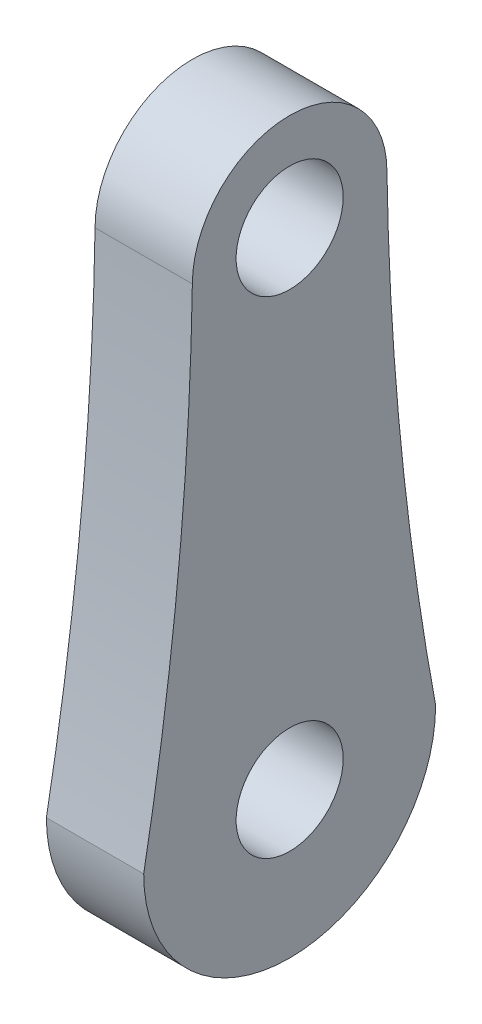
ISO-10303-21;
HEADER;
FILE_DESCRIPTION(('STEP AP214'),'2;1');
FILE_NAME('part.step','',(''),(''),'','','');
FILE_SCHEMA(('AUTOMOTIVE_DESIGN { 1 0 10303 214 1 1 1 1 }'));
ENDSEC;
DATA;
#1=APPLICATION_CONTEXT('core data for automotive mechanical design processes');
#2=APPLICATION_PROTOCOL_DEFINITION('international standard','automotive_design',2000,#1);
#3=PRODUCT_CONTEXT('',#1,'mechanical');
#4=PRODUCT('Part','Part','',(#3));
#5=PRODUCT_RELATED_PRODUCT_CATEGORY('part','',(#4));
#6=PRODUCT_DEFINITION_FORMATION('','',#4);
#7=PRODUCT_DEFINITION_CONTEXT('part definition',#1,'design');
#8=PRODUCT_DEFINITION('design','',#6,#7);
#9=PRODUCT_DEFINITION_SHAPE('','',#8);
#10=(LENGTH_UNIT() NAMED_UNIT(*) SI_UNIT(.MILLI.,.METRE.));
#11=(NAMED_UNIT(*) PLANE_ANGLE_UNIT() SI_UNIT($,.RADIAN.));
#12=(NAMED_UNIT(*) SI_UNIT($,.STERADIAN.) SOLID_ANGLE_UNIT());
#13=UNCERTAINTY_MEASURE_WITH_UNIT(LENGTH_MEASURE(1.E-05),#10,'distance_accuracy_value','');
#14=(GEOMETRIC_REPRESENTATION_CONTEXT(3) GLOBAL_UNCERTAINTY_ASSIGNED_CONTEXT((#13)) GLOBAL_UNIT_ASSIGNED_CONTEXT((#10,
#11,#12)) REPRESENTATION_CONTEXT('',''));
#15=CARTESIAN_POINT('',(0.,0.,0.));
#16=DIRECTION('',(0.,0.,1.));
#17=DIRECTION('',(1.,0.,0.));
#18=AXIS2_PLACEMENT_3D('',#15,#16,#17);
#19=CARTESIAN_POINT('',(10.,54.7462452909756,-309.962452909757));
#20=DIRECTION('',(-1.,0.,0.));
#21=DIRECTION('',(0.,0.,1.));
#22=AXIS2_PLACEMENT_3D('',#19,#20,#21);
#23=CYLINDRICAL_SURFACE('',#22,300.);
#24=CARTESIAN_POINT('',(0.,54.7462452909756,-309.962452909757));
#25=DIRECTION('',(1.,0.,0.));
#26=DIRECTION('',(0.,0.,-1.));
#27=AXIS2_PLACEMENT_3D('',#24,#25,#26);
#28=CIRCLE('',#27,300.);
#29=CARTESIAN_POINT('',(0.,49.9999999999995,-10.));
#30=VERTEX_POINT('',#29);
#31=CARTESIAN_POINT('',(0.,-2.5804011705155E-13,-15.));
#32=VERTEX_POINT('',#31);
#33=EDGE_CURVE('E108',#30,#32,#28,.T.);
#34=ORIENTED_EDGE('',*,*,#33,.F.);
#35=DIRECTION('',(-1.,0.,0.));
#36=VECTOR('',#35,1.);
#37=CARTESIAN_POINT('',(10.,49.9999999999995,-10.));
#38=LINE('',#37,#36);
#39=CARTESIAN_POINT('',(10.,49.9999999999995,-10.));
#40=VERTEX_POINT('',#39);
#41=EDGE_CURVE('E11',#40,#30,#38,.T.);
#42=ORIENTED_EDGE('',*,*,#41,.F.);
#43=CARTESIAN_POINT('',(10.,54.7462452909756,-309.962452909757));
#44=DIRECTION('',(1.,0.,0.));
#45=DIRECTION('',(0.,0.,-1.));
#46=AXIS2_PLACEMENT_3D('',#43,#44,#45);
#47=CIRCLE('',#46,300.);
#48=CARTESIAN_POINT('',(10.,-2.5804011705155E-13,-15.));
#49=VERTEX_POINT('',#48);
#50=EDGE_CURVE('E92',#40,#49,#47,.T.);
#51=ORIENTED_EDGE('',*,*,#50,.T.);
#52=DIRECTION('',(-1.,0.,0.));
#53=VECTOR('',#52,1.);
#54=CARTESIAN_POINT('',(10.,-2.5804011705155E-13,-15.));
#55=LINE('',#54,#53);
#56=EDGE_CURVE('E81',#49,#32,#55,.T.);
#57=ORIENTED_EDGE('',*,*,#56,.T.);
#58=EDGE_LOOP('',(#34,#42,#51,#57));
#59=FACE_BOUND('',#58,.T.);
#60=ADVANCED_FACE('F41',(#59),#23,.F.);
#61=CARTESIAN_POINT('',(10.,50.,0.));
#62=DIRECTION('',(-1.,0.,0.));
#63=DIRECTION('',(0.,0.,1.));
#64=AXIS2_PLACEMENT_3D('',#61,#62,#63);
#65=CYLINDRICAL_SURFACE('',#64,10.);
#66=CARTESIAN_POINT('',(0.,50.,0.));
#67=DIRECTION('',(1.,0.,0.));
#68=DIRECTION('',(0.,0.,-1.));
#69=AXIS2_PLACEMENT_3D('',#66,#67,#68);
#70=CIRCLE('',#69,10.);
#71=CARTESIAN_POINT('',(0.,49.9999999999991,10.));
#72=VERTEX_POINT('',#71);
#73=EDGE_CURVE('E98',#30,#72,#70,.T.);
#74=ORIENTED_EDGE('',*,*,#73,.T.);
#75=DIRECTION('',(-1.,0.,0.));
#76=VECTOR('',#75,1.);
#77=CARTESIAN_POINT('',(10.,49.9999999999991,10.));
#78=LINE('',#77,#76);
#79=CARTESIAN_POINT('',(10.,49.9999999999991,10.));
#80=VERTEX_POINT('',#79);
#81=EDGE_CURVE('E50',#80,#72,#78,.T.);
#82=ORIENTED_EDGE('',*,*,#81,.F.);
#83=CARTESIAN_POINT('',(10.,50.,0.));
#84=DIRECTION('',(1.,0.,0.));
#85=DIRECTION('',(0.,0.,-1.));
#86=AXIS2_PLACEMENT_3D('',#83,#84,#85);
#87=CIRCLE('',#86,10.);
#88=EDGE_CURVE('E87',#40,#80,#87,.T.);
#89=ORIENTED_EDGE('',*,*,#88,.F.);
#90=ORIENTED_EDGE('',*,*,#41,.T.);
#91=EDGE_LOOP('',(#74,#82,#89,#90));
#92=FACE_BOUND('',#91,.T.);
#93=ADVANCED_FACE('F96',(#92),#65,.T.);
#94=CARTESIAN_POINT('',(10.,54.7462452909756,309.962452909757));
#95=DIRECTION('',(-1.,0.,0.));
#96=DIRECTION('',(0.,0.,1.));
#97=AXIS2_PLACEMENT_3D('',#94,#95,#96);
#98=CYLINDRICAL_SURFACE('',#97,300.);
#99=CARTESIAN_POINT('',(0.,54.7462452909756,309.962452909757));
#100=DIRECTION('',(1.,0.,0.));
#101=DIRECTION('',(0.,0.,-1.));
#102=AXIS2_PLACEMENT_3D('',#99,#100,#101);
#103=CIRCLE('',#102,300.);
#104=CARTESIAN_POINT('',(0.,-2.5804011705155E-13,15.));
#105=VERTEX_POINT('',#104);
#106=EDGE_CURVE('E74',#72,#105,#103,.F.);
#107=ORIENTED_EDGE('',*,*,#106,.T.);
#108=DIRECTION('',(-1.,0.,0.));
#109=VECTOR('',#108,1.);
#110=CARTESIAN_POINT('',(10.,-2.5804011705155E-13,15.));
#111=LINE('',#110,#109);
#112=CARTESIAN_POINT('',(10.,-2.5804011705155E-13,15.));
#113=VERTEX_POINT('',#112);
#114=EDGE_CURVE('E100',#113,#105,#111,.T.);
#115=ORIENTED_EDGE('',*,*,#114,.F.);
#116=CARTESIAN_POINT('',(10.,54.7462452909756,309.962452909757));
#117=DIRECTION('',(1.,0.,0.));
#118=DIRECTION('',(0.,0.,-1.));
#119=AXIS2_PLACEMENT_3D('',#116,#117,#118);
#120=CIRCLE('',#119,300.);
#121=EDGE_CURVE('E91',#80,#113,#120,.F.);
#122=ORIENTED_EDGE('',*,*,#121,.F.);
#123=ORIENTED_EDGE('',*,*,#81,.T.);
#124=EDGE_LOOP('',(#107,#115,#122,#123));
#125=FACE_BOUND('',#124,.T.);
#126=ADVANCED_FACE('F101',(#125),#98,.F.);
#127=CARTESIAN_POINT('',(10.,0.,0.));
#128=DIRECTION('',(-1.,0.,0.));
#129=DIRECTION('',(0.,0.,1.));
#130=AXIS2_PLACEMENT_3D('',#127,#128,#129);
#131=CYLINDRICAL_SURFACE('',#130,15.);
#132=CARTESIAN_POINT('',(0.,0.,0.));
#133=DIRECTION('',(1.,0.,0.));
#134=DIRECTION('',(0.,0.,-1.));
#135=AXIS2_PLACEMENT_3D('',#132,#133,#134);
#136=CIRCLE('',#135,15.);
#137=EDGE_CURVE('E117',#105,#32,#136,.T.);
#138=ORIENTED_EDGE('',*,*,#137,.T.);
#139=ORIENTED_EDGE('',*,*,#56,.F.);
#140=CARTESIAN_POINT('',(10.,0.,0.));
#141=DIRECTION('',(1.,0.,0.));
#142=DIRECTION('',(0.,0.,-1.));
#143=AXIS2_PLACEMENT_3D('',#140,#141,#142);
#144=CIRCLE('',#143,15.);
#145=EDGE_CURVE('E58',#113,#49,#144,.T.);
#146=ORIENTED_EDGE('',*,*,#145,.F.);
#147=ORIENTED_EDGE('',*,*,#114,.T.);
#148=EDGE_LOOP('',(#138,#139,#146,#147));
#149=FACE_BOUND('',#148,.T.);
#150=ADVANCED_FACE('F125',(#149),#131,.T.);
#151=CARTESIAN_POINT('',(10.,0.,0.));
#152=DIRECTION('',(1.,0.,0.));
#153=DIRECTION('',(0.,0.,-1.));
#154=AXIS2_PLACEMENT_3D('',#151,#152,#153);
#155=PLANE('',#154);
#156=CARTESIAN_POINT('',(10.,0.,0.));
#157=DIRECTION('',(1.,0.,0.));
#158=DIRECTION('',(0.,0.,-1.));
#159=AXIS2_PLACEMENT_3D('',#156,#157,#158);
#160=CIRCLE('',#159,5.49999999999999);
#161=CARTESIAN_POINT('',(10.,0.,-5.49999999999999));
#162=VERTEX_POINT('',#161);
#163=EDGE_CURVE('E160',#162,#162,#160,.T.);
#164=ORIENTED_EDGE('',*,*,#163,.F.);
#165=EDGE_LOOP('',(#164));
#166=FACE_BOUND('',#165,.T.);
#167=CARTESIAN_POINT('',(10.,50.,0.));
#168=DIRECTION('',(1.,0.,0.));
#169=DIRECTION('',(0.,0.,-1.));
#170=AXIS2_PLACEMENT_3D('',#167,#168,#169);
#171=CIRCLE('',#170,5.49999999999999);
#172=CARTESIAN_POINT('',(10.,50.,-5.49999999999999));
#173=VERTEX_POINT('',#172);
#174=EDGE_CURVE('E164',#173,#173,#171,.T.);
#175=ORIENTED_EDGE('',*,*,#174,.F.);
#176=EDGE_LOOP('',(#175));
#177=FACE_BOUND('',#176,.T.);
#178=ORIENTED_EDGE('',*,*,#50,.F.);
#179=ORIENTED_EDGE('',*,*,#88,.T.);
#180=ORIENTED_EDGE('',*,*,#121,.T.);
#181=ORIENTED_EDGE('',*,*,#145,.T.);
#182=EDGE_LOOP('',(#178,#179,#180,#181));
#183=FACE_BOUND('',#182,.T.);
#184=ADVANCED_FACE('F89',(#166,#177,#183),#155,.T.);
#185=CARTESIAN_POINT('',(0.,0.,0.));
#186=DIRECTION('',(1.,0.,0.));
#187=DIRECTION('',(0.,0.,-1.));
#188=AXIS2_PLACEMENT_3D('',#185,#186,#187);
#189=PLANE('',#188);
#190=CARTESIAN_POINT('',(0.,0.,0.));
#191=DIRECTION('',(1.,0.,0.));
#192=DIRECTION('',(0.,0.,-1.));
#193=AXIS2_PLACEMENT_3D('',#190,#191,#192);
#194=CIRCLE('',#193,5.5);
#195=CARTESIAN_POINT('',(0.,0.,-5.5));
#196=VERTEX_POINT('',#195);
#197=EDGE_CURVE('E157',#196,#196,#194,.T.);
#198=ORIENTED_EDGE('',*,*,#197,.T.);
#199=EDGE_LOOP('',(#198));
#200=FACE_BOUND('',#199,.T.);
#201=CARTESIAN_POINT('',(0.,50.,0.));
#202=DIRECTION('',(1.,0.,0.));
#203=DIRECTION('',(0.,0.,-1.));
#204=AXIS2_PLACEMENT_3D('',#201,#202,#203);
#205=CIRCLE('',#204,5.5);
#206=CARTESIAN_POINT('',(0.,50.,-5.5));
#207=VERTEX_POINT('',#206);
#208=EDGE_CURVE('E112',#207,#207,#205,.T.);
#209=ORIENTED_EDGE('',*,*,#208,.T.);
#210=EDGE_LOOP('',(#209));
#211=FACE_BOUND('',#210,.T.);
#212=ORIENTED_EDGE('',*,*,#33,.T.);
#213=ORIENTED_EDGE('',*,*,#137,.F.);
#214=ORIENTED_EDGE('',*,*,#106,.F.);
#215=ORIENTED_EDGE('',*,*,#73,.F.);
#216=EDGE_LOOP('',(#212,#213,#214,#215));
#217=FACE_BOUND('',#216,.T.);
#218=ADVANCED_FACE('F127',(#200,#211,#217),#189,.F.);
#219=CARTESIAN_POINT('',(10.,50.,0.));
#220=DIRECTION('',(1.,0.,0.));
#221=DIRECTION('',(0.,0.,-1.));
#222=AXIS2_PLACEMENT_3D('',#219,#220,#221);
#223=CYLINDRICAL_SURFACE('',#222,5.49999999999999);
#224=ORIENTED_EDGE('',*,*,#208,.F.);
#225=EDGE_LOOP('',(#224));
#226=FACE_BOUND('',#225,.T.);
#227=ORIENTED_EDGE('',*,*,#174,.T.);
#228=EDGE_LOOP('',(#227));
#229=FACE_BOUND('',#228,.T.);
#230=ADVANCED_FACE('F141',(#226,#229),#223,.F.);
#231=CARTESIAN_POINT('',(10.,0.,0.));
#232=DIRECTION('',(1.,0.,0.));
#233=DIRECTION('',(0.,0.,-1.));
#234=AXIS2_PLACEMENT_3D('',#231,#232,#233);
#235=CYLINDRICAL_SURFACE('',#234,5.49999999999999);
#236=ORIENTED_EDGE('',*,*,#197,.F.);
#237=EDGE_LOOP('',(#236));
#238=FACE_BOUND('',#237,.T.);
#239=ORIENTED_EDGE('',*,*,#163,.T.);
#240=EDGE_LOOP('',(#239));
#241=FACE_BOUND('',#240,.T.);
#242=ADVANCED_FACE('F148',(#238,#241),#235,.F.);
#243=CLOSED_SHELL('',(#60,#93,#126,#150,#184,#218,#230,#242));
#244=MANIFOLD_SOLID_BREP('B2',#243);
#245=ADVANCED_BREP_SHAPE_REPRESENTATION('',(#18,#244),#14);
#246=SHAPE_DEFINITION_REPRESENTATION(#9,#245);
ENDSEC;
END-ISO-10303-21;
